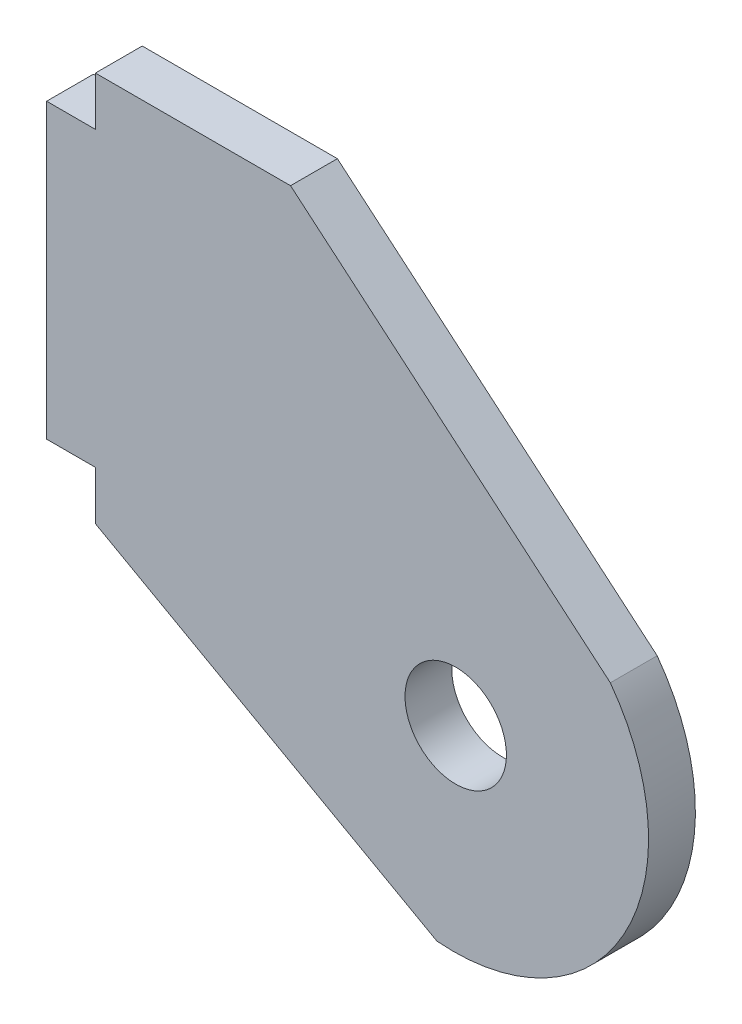
ISO-10303-21;
HEADER;
FILE_DESCRIPTION(('STEP AP214'),'2;1');
FILE_NAME('part.step','',(''),(''),'','','');
FILE_SCHEMA(('AUTOMOTIVE_DESIGN { 1 0 10303 214 1 1 1 1 }'));
ENDSEC;
DATA;
#1=APPLICATION_CONTEXT('core data for automotive mechanical design processes');
#2=APPLICATION_PROTOCOL_DEFINITION('international standard','automotive_design',2000,#1);
#3=PRODUCT_CONTEXT('',#1,'mechanical');
#4=PRODUCT('Part','Part','',(#3));
#5=PRODUCT_RELATED_PRODUCT_CATEGORY('part','',(#4));
#6=PRODUCT_DEFINITION_FORMATION('','',#4);
#7=PRODUCT_DEFINITION_CONTEXT('part definition',#1,'design');
#8=PRODUCT_DEFINITION('design','',#6,#7);
#9=PRODUCT_DEFINITION_SHAPE('','',#8);
#10=(LENGTH_UNIT() NAMED_UNIT(*) SI_UNIT(.MILLI.,.METRE.));
#11=(NAMED_UNIT(*) PLANE_ANGLE_UNIT() SI_UNIT($,.RADIAN.));
#12=(NAMED_UNIT(*) SI_UNIT($,.STERADIAN.) SOLID_ANGLE_UNIT());
#13=UNCERTAINTY_MEASURE_WITH_UNIT(LENGTH_MEASURE(1.E-05),#10,'distance_accuracy_value','');
#14=(GEOMETRIC_REPRESENTATION_CONTEXT(3) GLOBAL_UNCERTAINTY_ASSIGNED_CONTEXT((#13)) GLOBAL_UNIT_ASSIGNED_CONTEXT((#10,
#11,#12)) REPRESENTATION_CONTEXT('',''));
#15=CARTESIAN_POINT('',(0.,0.,0.));
#16=DIRECTION('',(0.,0.,1.));
#17=DIRECTION('',(1.,0.,0.));
#18=AXIS2_PLACEMENT_3D('',#15,#16,#17);
#19=CARTESIAN_POINT('',(451.22163735712,-25.1612518869902,3.048));
#20=DIRECTION('',(0.,0.,1.));
#21=DIRECTION('',(1.,0.,0.));
#22=AXIS2_PLACEMENT_3D('',#19,#20,#21);
#23=PLANE('',#22);
#24=DIRECTION('',(0.,-1.,0.));
#25=VECTOR('',#24,1.);
#26=CARTESIAN_POINT('',(427.91942335712,0.,3.048));
#27=LINE('',#26,#25);
#28=CARTESIAN_POINT('',(427.91942335712,0.,3.048));
#29=VERTEX_POINT('',#28);
#30=CARTESIAN_POINT('',(427.91942335712,-3.17499999999997,3.048));
#31=VERTEX_POINT('',#30);
#32=EDGE_CURVE('E159',#29,#31,#27,.T.);
#33=ORIENTED_EDGE('',*,*,#32,.T.);
#34=DIRECTION('',(-1.,0.,0.));
#35=VECTOR('',#34,1.);
#36=CARTESIAN_POINT('',(424.74442335712,-3.17499999999998,3.048));
#37=LINE('',#36,#35);
#38=CARTESIAN_POINT('',(424.74442335712,-3.17499999999998,3.048));
#39=VERTEX_POINT('',#38);
#40=EDGE_CURVE('E102',#31,#39,#37,.T.);
#41=ORIENTED_EDGE('',*,*,#40,.T.);
#42=DIRECTION('',(0.,-1.,0.));
#43=VECTOR('',#42,1.);
#44=CARTESIAN_POINT('',(424.74442335712,-22.225,3.048));
#45=LINE('',#44,#43);
#46=CARTESIAN_POINT('',(424.74442335712,-22.225,3.048));
#47=VERTEX_POINT('',#46);
#48=EDGE_CURVE('E177',#39,#47,#45,.T.);
#49=ORIENTED_EDGE('',*,*,#48,.T.);
#50=DIRECTION('',(1.,0.,0.));
#51=VECTOR('',#50,1.);
#52=CARTESIAN_POINT('',(427.91942335712,-22.225,3.048));
#53=LINE('',#52,#51);
#54=CARTESIAN_POINT('',(427.91942335712,-22.225,3.048));
#55=VERTEX_POINT('',#54);
#56=EDGE_CURVE('E194',#47,#55,#53,.T.);
#57=ORIENTED_EDGE('',*,*,#56,.T.);
#58=DIRECTION('',(0.,-1.,0.));
#59=VECTOR('',#58,1.);
#60=CARTESIAN_POINT('',(427.91942335712,-22.225,3.048));
#61=LINE('',#60,#59);
#62=CARTESIAN_POINT('',(427.91942335712,-25.3999999999999,3.048));
#63=VERTEX_POINT('',#62);
#64=EDGE_CURVE('E193',#55,#63,#61,.T.);
#65=ORIENTED_EDGE('',*,*,#64,.T.);
#66=DIRECTION('',(0.873016540263343,-0.487690599075503,0.));
#67=VECTOR('',#66,1.);
#68=CARTESIAN_POINT('',(427.91942335712,-25.3999999999999,3.048));
#69=LINE('',#68,#67);
#70=CARTESIAN_POINT('',(450.14442335712,-37.8154847755616,3.048));
#71=VERTEX_POINT('',#70);
#72=EDGE_CURVE('E124',#63,#71,#69,.T.);
#73=ORIENTED_EDGE('',*,*,#72,.T.);
#74=CARTESIAN_POINT('',(451.22163735712,-25.1612518869902,3.048));
#75=DIRECTION('',(0.,0.,1.));
#76=DIRECTION('',(1.,0.,0.));
#77=AXIS2_PLACEMENT_3D('',#74,#75,#76);
#78=CIRCLE('',#77,12.7);
#79=CARTESIAN_POINT('',(461.432219062766,-17.6091646766659,3.048));
#80=VERTEX_POINT('',#79);
#81=EDGE_CURVE('E118',#71,#80,#78,.T.);
#82=ORIENTED_EDGE('',*,*,#81,.T.);
#83=DIRECTION('',(-0.763416353611531,0.645906704593221,0.));
#84=VECTOR('',#83,1.);
#85=CARTESIAN_POINT('',(440.61942335712,0.,3.048));
#86=LINE('',#85,#84);
#87=CARTESIAN_POINT('',(440.61942335712,0.,3.048));
#88=VERTEX_POINT('',#87);
#89=EDGE_CURVE('E122',#80,#88,#86,.T.);
#90=ORIENTED_EDGE('',*,*,#89,.T.);
#91=DIRECTION('',(-1.,0.,0.));
#92=VECTOR('',#91,1.);
#93=CARTESIAN_POINT('',(427.91942335712,0.,3.048));
#94=LINE('',#93,#92);
#95=EDGE_CURVE('E56',#88,#29,#94,.T.);
#96=ORIENTED_EDGE('',*,*,#95,.T.);
#97=EDGE_LOOP('',(#33,#41,#49,#57,#65,#73,#82,#90,#96));
#98=FACE_BOUND('',#97,.T.);
#99=CARTESIAN_POINT('',(451.36820500912,-25.0582413885403,3.048));
#100=DIRECTION('',(0.,0.,1.));
#101=DIRECTION('',(1.,0.,0.));
#102=AXIS2_PLACEMENT_3D('',#99,#100,#101);
#103=CIRCLE('',#102,3.30000000000003);
#104=CARTESIAN_POINT('',(448.06820500912,-25.0582413885403,3.048));
#105=VERTEX_POINT('',#104);
#106=EDGE_CURVE('E146',#105,#105,#103,.T.);
#107=ORIENTED_EDGE('',*,*,#106,.F.);
#108=EDGE_LOOP('',(#107));
#109=FACE_BOUND('',#108,.T.);
#110=ADVANCED_FACE('F39',(#98,#109),#23,.T.);
#111=CARTESIAN_POINT('',(451.22163735712,-25.1612518869902,0.));
#112=DIRECTION('',(0.,0.,1.));
#113=DIRECTION('',(1.,0.,0.));
#114=AXIS2_PLACEMENT_3D('',#111,#112,#113);
#115=PLANE('',#114);
#116=DIRECTION('',(0.,-1.,0.));
#117=VECTOR('',#116,1.);
#118=CARTESIAN_POINT('',(427.91942335712,0.,0.));
#119=LINE('',#118,#117);
#120=CARTESIAN_POINT('',(427.91942335712,0.,0.));
#121=VERTEX_POINT('',#120);
#122=CARTESIAN_POINT('',(427.91942335712,-3.17499999999997,0.));
#123=VERTEX_POINT('',#122);
#124=EDGE_CURVE('E142',#121,#123,#119,.T.);
#125=ORIENTED_EDGE('',*,*,#124,.F.);
#126=DIRECTION('',(-1.,0.,0.));
#127=VECTOR('',#126,1.);
#128=CARTESIAN_POINT('',(427.91942335712,0.,0.));
#129=LINE('',#128,#127);
#130=CARTESIAN_POINT('',(440.61942335712,0.,0.));
#131=VERTEX_POINT('',#130);
#132=EDGE_CURVE('E94',#131,#121,#129,.T.);
#133=ORIENTED_EDGE('',*,*,#132,.F.);
#134=DIRECTION('',(-0.763416353611531,0.645906704593221,0.));
#135=VECTOR('',#134,1.);
#136=CARTESIAN_POINT('',(440.61942335712,0.,0.));
#137=LINE('',#136,#135);
#138=CARTESIAN_POINT('',(461.432219062766,-17.6091646766659,0.));
#139=VERTEX_POINT('',#138);
#140=EDGE_CURVE('E88',#139,#131,#137,.T.);
#141=ORIENTED_EDGE('',*,*,#140,.F.);
#142=CARTESIAN_POINT('',(451.22163735712,-25.1612518869902,0.));
#143=DIRECTION('',(0.,0.,1.));
#144=DIRECTION('',(1.,0.,0.));
#145=AXIS2_PLACEMENT_3D('',#142,#143,#144);
#146=CIRCLE('',#145,12.7);
#147=CARTESIAN_POINT('',(450.14442335712,-37.8154847755616,0.));
#148=VERTEX_POINT('',#147);
#149=EDGE_CURVE('E132',#148,#139,#146,.T.);
#150=ORIENTED_EDGE('',*,*,#149,.F.);
#151=DIRECTION('',(0.873016540263343,-0.487690599075503,0.));
#152=VECTOR('',#151,1.);
#153=CARTESIAN_POINT('',(427.91942335712,-25.3999999999999,0.));
#154=LINE('',#153,#152);
#155=CARTESIAN_POINT('',(427.91942335712,-25.3999999999999,0.));
#156=VERTEX_POINT('',#155);
#157=EDGE_CURVE('E154',#156,#148,#154,.T.);
#158=ORIENTED_EDGE('',*,*,#157,.F.);
#159=DIRECTION('',(0.,-1.,0.));
#160=VECTOR('',#159,1.);
#161=CARTESIAN_POINT('',(427.91942335712,-22.225,0.));
#162=LINE('',#161,#160);
#163=CARTESIAN_POINT('',(427.91942335712,-22.225,0.));
#164=VERTEX_POINT('',#163);
#165=EDGE_CURVE('E152',#164,#156,#162,.T.);
#166=ORIENTED_EDGE('',*,*,#165,.F.);
#167=DIRECTION('',(1.,0.,0.));
#168=VECTOR('',#167,1.);
#169=CARTESIAN_POINT('',(427.91942335712,-22.225,0.));
#170=LINE('',#169,#168);
#171=CARTESIAN_POINT('',(424.74442335712,-22.225,0.));
#172=VERTEX_POINT('',#171);
#173=EDGE_CURVE('E150',#172,#164,#170,.T.);
#174=ORIENTED_EDGE('',*,*,#173,.F.);
#175=DIRECTION('',(0.,-1.,0.));
#176=VECTOR('',#175,1.);
#177=CARTESIAN_POINT('',(424.74442335712,-22.225,0.));
#178=LINE('',#177,#176);
#179=CARTESIAN_POINT('',(424.74442335712,-3.17499999999998,0.));
#180=VERTEX_POINT('',#179);
#181=EDGE_CURVE('E148',#180,#172,#178,.T.);
#182=ORIENTED_EDGE('',*,*,#181,.F.);
#183=DIRECTION('',(-1.,0.,0.));
#184=VECTOR('',#183,1.);
#185=CARTESIAN_POINT('',(424.74442335712,-3.17499999999998,0.));
#186=LINE('',#185,#184);
#187=EDGE_CURVE('E145',#123,#180,#186,.T.);
#188=ORIENTED_EDGE('',*,*,#187,.F.);
#189=EDGE_LOOP('',(#125,#133,#141,#150,#158,#166,#174,#182,#188));
#190=FACE_BOUND('',#189,.T.);
#191=CARTESIAN_POINT('',(451.36820500912,-25.0582413885403,0.));
#192=DIRECTION('',(0.,0.,1.));
#193=DIRECTION('',(1.,0.,0.));
#194=AXIS2_PLACEMENT_3D('',#191,#192,#193);
#195=CIRCLE('',#194,3.30000000000003);
#196=CARTESIAN_POINT('',(448.06820500912,-25.0582413885403,0.));
#197=VERTEX_POINT('',#196);
#198=EDGE_CURVE('E201',#197,#197,#195,.T.);
#199=ORIENTED_EDGE('',*,*,#198,.T.);
#200=EDGE_LOOP('',(#199));
#201=FACE_BOUND('',#200,.T.);
#202=ADVANCED_FACE('F181',(#190,#201),#115,.F.);
#203=CARTESIAN_POINT('',(427.91942335712,0.,3.048));
#204=DIRECTION('',(1.,0.,0.));
#205=DIRECTION('',(0.,0.,-1.));
#206=AXIS2_PLACEMENT_3D('',#203,#204,#205);
#207=PLANE('',#206);
#208=ORIENTED_EDGE('',*,*,#124,.T.);
#209=DIRECTION('',(0.,0.,-1.));
#210=VECTOR('',#209,1.);
#211=CARTESIAN_POINT('',(427.91942335712,-3.17499999999997,3.048));
#212=LINE('',#211,#210);
#213=EDGE_CURVE('E11',#31,#123,#212,.T.);
#214=ORIENTED_EDGE('',*,*,#213,.F.);
#215=ORIENTED_EDGE('',*,*,#32,.F.);
#216=DIRECTION('',(0.,0.,-1.));
#217=VECTOR('',#216,1.);
#218=CARTESIAN_POINT('',(427.91942335712,0.,3.048));
#219=LINE('',#218,#217);
#220=EDGE_CURVE('E138',#29,#121,#219,.T.);
#221=ORIENTED_EDGE('',*,*,#220,.T.);
#222=EDGE_LOOP('',(#208,#214,#215,#221));
#223=FACE_BOUND('',#222,.T.);
#224=ADVANCED_FACE('F41',(#223),#207,.F.);
#225=CARTESIAN_POINT('',(424.74442335712,-3.17499999999998,3.048));
#226=DIRECTION('',(0.,-1.,0.));
#227=DIRECTION('',(1.,0.,0.));
#228=AXIS2_PLACEMENT_3D('',#225,#226,#227);
#229=PLANE('',#228);
#230=ORIENTED_EDGE('',*,*,#187,.T.);
#231=DIRECTION('',(0.,0.,-1.));
#232=VECTOR('',#231,1.);
#233=CARTESIAN_POINT('',(424.74442335712,-3.17499999999998,3.048));
#234=LINE('',#233,#232);
#235=EDGE_CURVE('E48',#39,#180,#234,.T.);
#236=ORIENTED_EDGE('',*,*,#235,.F.);
#237=ORIENTED_EDGE('',*,*,#40,.F.);
#238=ORIENTED_EDGE('',*,*,#213,.T.);
#239=EDGE_LOOP('',(#230,#236,#237,#238));
#240=FACE_BOUND('',#239,.T.);
#241=ADVANCED_FACE('F233',(#240),#229,.F.);
#242=CARTESIAN_POINT('',(424.74442335712,-22.225,3.048));
#243=DIRECTION('',(1.,0.,0.));
#244=DIRECTION('',(0.,0.,-1.));
#245=AXIS2_PLACEMENT_3D('',#242,#243,#244);
#246=PLANE('',#245);
#247=ORIENTED_EDGE('',*,*,#181,.T.);
#248=DIRECTION('',(0.,0.,-1.));
#249=VECTOR('',#248,1.);
#250=CARTESIAN_POINT('',(424.74442335712,-22.225,3.048));
#251=LINE('',#250,#249);
#252=EDGE_CURVE('E169',#47,#172,#251,.T.);
#253=ORIENTED_EDGE('',*,*,#252,.F.);
#254=ORIENTED_EDGE('',*,*,#48,.F.);
#255=ORIENTED_EDGE('',*,*,#235,.T.);
#256=EDGE_LOOP('',(#247,#253,#254,#255));
#257=FACE_BOUND('',#256,.T.);
#258=ADVANCED_FACE('F175',(#257),#246,.F.);
#259=CARTESIAN_POINT('',(427.91942335712,-22.225,3.048));
#260=DIRECTION('',(0.,1.,0.));
#261=DIRECTION('',(-1.,0.,0.));
#262=AXIS2_PLACEMENT_3D('',#259,#260,#261);
#263=PLANE('',#262);
#264=ORIENTED_EDGE('',*,*,#173,.T.);
#265=DIRECTION('',(0.,0.,-1.));
#266=VECTOR('',#265,1.);
#267=CARTESIAN_POINT('',(427.91942335712,-22.225,3.048));
#268=LINE('',#267,#266);
#269=EDGE_CURVE('E166',#55,#164,#268,.T.);
#270=ORIENTED_EDGE('',*,*,#269,.F.);
#271=ORIENTED_EDGE('',*,*,#56,.F.);
#272=ORIENTED_EDGE('',*,*,#252,.T.);
#273=EDGE_LOOP('',(#264,#270,#271,#272));
#274=FACE_BOUND('',#273,.T.);
#275=ADVANCED_FACE('F187',(#274),#263,.F.);
#276=CARTESIAN_POINT('',(427.91942335712,-22.225,3.048));
#277=DIRECTION('',(1.,0.,0.));
#278=DIRECTION('',(0.,0.,-1.));
#279=AXIS2_PLACEMENT_3D('',#276,#277,#278);
#280=PLANE('',#279);
#281=ORIENTED_EDGE('',*,*,#165,.T.);
#282=DIRECTION('',(0.,0.,-1.));
#283=VECTOR('',#282,1.);
#284=CARTESIAN_POINT('',(427.91942335712,-25.3999999999999,3.048));
#285=LINE('',#284,#283);
#286=EDGE_CURVE('E163',#63,#156,#285,.T.);
#287=ORIENTED_EDGE('',*,*,#286,.F.);
#288=ORIENTED_EDGE('',*,*,#64,.F.);
#289=ORIENTED_EDGE('',*,*,#269,.T.);
#290=EDGE_LOOP('',(#281,#287,#288,#289));
#291=FACE_BOUND('',#290,.T.);
#292=ADVANCED_FACE('F191',(#291),#280,.F.);
#293=CARTESIAN_POINT('',(427.91942335712,-25.3999999999999,3.048));
#294=DIRECTION('',(0.487690599075503,0.873016540263343,0.));
#295=DIRECTION('',(-0.873016540263343,0.487690599075503,0.));
#296=AXIS2_PLACEMENT_3D('',#293,#294,#295);
#297=PLANE('',#296);
#298=ORIENTED_EDGE('',*,*,#157,.T.);
#299=DIRECTION('',(0.,0.,-1.));
#300=VECTOR('',#299,1.);
#301=CARTESIAN_POINT('',(450.14442335712,-37.8154847755616,3.048));
#302=LINE('',#301,#300);
#303=EDGE_CURVE('E133',#71,#148,#302,.T.);
#304=ORIENTED_EDGE('',*,*,#303,.F.);
#305=ORIENTED_EDGE('',*,*,#72,.F.);
#306=ORIENTED_EDGE('',*,*,#286,.T.);
#307=EDGE_LOOP('',(#298,#304,#305,#306));
#308=FACE_BOUND('',#307,.T.);
#309=ADVANCED_FACE('F224',(#308),#297,.F.);
#310=CARTESIAN_POINT('',(451.22163735712,-25.1612518869902,3.048));
#311=DIRECTION('',(0.,0.,-1.));
#312=DIRECTION('',(-1.,0.,0.));
#313=AXIS2_PLACEMENT_3D('',#310,#311,#312);
#314=CYLINDRICAL_SURFACE('',#313,12.7);
#315=ORIENTED_EDGE('',*,*,#149,.T.);
#316=DIRECTION('',(0.,0.,-1.));
#317=VECTOR('',#316,1.);
#318=CARTESIAN_POINT('',(461.432219062766,-17.6091646766659,3.048));
#319=LINE('',#318,#317);
#320=EDGE_CURVE('E129',#80,#139,#319,.T.);
#321=ORIENTED_EDGE('',*,*,#320,.F.);
#322=ORIENTED_EDGE('',*,*,#81,.F.);
#323=ORIENTED_EDGE('',*,*,#303,.T.);
#324=EDGE_LOOP('',(#315,#321,#322,#323));
#325=FACE_BOUND('',#324,.T.);
#326=ADVANCED_FACE('F130',(#325),#314,.T.);
#327=CARTESIAN_POINT('',(440.61942335712,0.,3.048));
#328=DIRECTION('',(-0.645906704593221,-0.763416353611531,0.));
#329=DIRECTION('',(0.763416353611531,-0.645906704593221,0.));
#330=AXIS2_PLACEMENT_3D('',#327,#328,#329);
#331=PLANE('',#330);
#332=ORIENTED_EDGE('',*,*,#140,.T.);
#333=DIRECTION('',(0.,0.,-1.));
#334=VECTOR('',#333,1.);
#335=CARTESIAN_POINT('',(440.61942335712,0.,3.048));
#336=LINE('',#335,#334);
#337=EDGE_CURVE('E134',#88,#131,#336,.T.);
#338=ORIENTED_EDGE('',*,*,#337,.F.);
#339=ORIENTED_EDGE('',*,*,#89,.F.);
#340=ORIENTED_EDGE('',*,*,#320,.T.);
#341=EDGE_LOOP('',(#332,#338,#339,#340));
#342=FACE_BOUND('',#341,.T.);
#343=ADVANCED_FACE('F136',(#342),#331,.F.);
#344=CARTESIAN_POINT('',(427.91942335712,0.,3.048));
#345=DIRECTION('',(0.,-1.,0.));
#346=DIRECTION('',(0.,0.,-1.));
#347=AXIS2_PLACEMENT_3D('',#344,#345,#346);
#348=PLANE('',#347);
#349=ORIENTED_EDGE('',*,*,#132,.T.);
#350=ORIENTED_EDGE('',*,*,#220,.F.);
#351=ORIENTED_EDGE('',*,*,#95,.F.);
#352=ORIENTED_EDGE('',*,*,#337,.T.);
#353=EDGE_LOOP('',(#349,#350,#351,#352));
#354=FACE_BOUND('',#353,.T.);
#355=ADVANCED_FACE('F217',(#354),#348,.F.);
#356=CARTESIAN_POINT('',(451.36820500912,-25.0582413885403,3.048));
#357=DIRECTION('',(0.,0.,-1.));
#358=DIRECTION('',(-1.,0.,0.));
#359=AXIS2_PLACEMENT_3D('',#356,#357,#358);
#360=CYLINDRICAL_SURFACE('',#359,3.30000000000003);
#361=CARTESIAN_POINT('',(448.06820500912,-25.0582413885403,3.048));
#362=CARTESIAN_POINT('',(448.06820500912,-25.0582413885403,3.01625));
#363=CARTESIAN_POINT('',(448.06820500912,-25.0582413885403,2.9845));
#364=CARTESIAN_POINT('',(448.06820500912,-25.0582413885403,2.921));
#365=CARTESIAN_POINT('',(448.06820500912,-25.0582413885403,2.88925));
#366=CARTESIAN_POINT('',(448.06820500912,-25.0582413885403,2.82575));
#367=CARTESIAN_POINT('',(448.06820500912,-25.0582413885403,2.794));
#368=CARTESIAN_POINT('',(448.06820500912,-25.0582413885403,2.7305));
#369=CARTESIAN_POINT('',(448.06820500912,-25.0582413885403,2.69875));
#370=CARTESIAN_POINT('',(448.06820500912,-25.0582413885403,2.63525));
#371=CARTESIAN_POINT('',(448.06820500912,-25.0582413885403,2.6035));
#372=CARTESIAN_POINT('',(448.06820500912,-25.0582413885403,2.54));
#373=CARTESIAN_POINT('',(448.06820500912,-25.0582413885403,2.50825));
#374=CARTESIAN_POINT('',(448.06820500912,-25.0582413885403,2.44475));
#375=CARTESIAN_POINT('',(448.06820500912,-25.0582413885403,2.413));
#376=CARTESIAN_POINT('',(448.06820500912,-25.0582413885403,2.3495));
#377=CARTESIAN_POINT('',(448.06820500912,-25.0582413885403,2.31775));
#378=CARTESIAN_POINT('',(448.06820500912,-25.0582413885403,2.25425));
#379=CARTESIAN_POINT('',(448.06820500912,-25.0582413885403,2.2225));
#380=CARTESIAN_POINT('',(448.06820500912,-25.0582413885403,2.159));
#381=CARTESIAN_POINT('',(448.06820500912,-25.0582413885403,2.12725));
#382=CARTESIAN_POINT('',(448.06820500912,-25.0582413885403,2.06375));
#383=CARTESIAN_POINT('',(448.06820500912,-25.0582413885403,2.032));
#384=CARTESIAN_POINT('',(448.06820500912,-25.0582413885403,1.9685));
#385=CARTESIAN_POINT('',(448.06820500912,-25.0582413885403,1.93675));
#386=CARTESIAN_POINT('',(448.06820500912,-25.0582413885403,1.87325));
#387=CARTESIAN_POINT('',(448.06820500912,-25.0582413885403,1.8415));
#388=CARTESIAN_POINT('',(448.06820500912,-25.0582413885403,1.778));
#389=CARTESIAN_POINT('',(448.06820500912,-25.0582413885403,1.74625));
#390=CARTESIAN_POINT('',(448.06820500912,-25.0582413885403,1.68275));
#391=CARTESIAN_POINT('',(448.06820500912,-25.0582413885403,1.651));
#392=CARTESIAN_POINT('',(448.06820500912,-25.0582413885403,1.5875));
#393=CARTESIAN_POINT('',(448.06820500912,-25.0582413885403,1.55575));
#394=CARTESIAN_POINT('',(448.06820500912,-25.0582413885403,1.49225));
#395=CARTESIAN_POINT('',(448.06820500912,-25.0582413885403,1.4605));
#396=CARTESIAN_POINT('',(448.06820500912,-25.0582413885403,1.397));
#397=CARTESIAN_POINT('',(448.06820500912,-25.0582413885403,1.36525));
#398=CARTESIAN_POINT('',(448.06820500912,-25.0582413885403,1.30175));
#399=CARTESIAN_POINT('',(448.06820500912,-25.0582413885403,1.27));
#400=CARTESIAN_POINT('',(448.06820500912,-25.0582413885403,1.2065));
#401=CARTESIAN_POINT('',(448.06820500912,-25.0582413885403,1.17475));
#402=CARTESIAN_POINT('',(448.06820500912,-25.0582413885403,1.11125));
#403=CARTESIAN_POINT('',(448.06820500912,-25.0582413885403,1.0795));
#404=CARTESIAN_POINT('',(448.06820500912,-25.0582413885403,1.016));
#405=CARTESIAN_POINT('',(448.06820500912,-25.0582413885403,0.98425));
#406=CARTESIAN_POINT('',(448.06820500912,-25.0582413885403,0.92075));
#407=CARTESIAN_POINT('',(448.06820500912,-25.0582413885403,0.889));
#408=CARTESIAN_POINT('',(448.06820500912,-25.0582413885403,0.8255));
#409=CARTESIAN_POINT('',(448.06820500912,-25.0582413885403,0.79375));
#410=CARTESIAN_POINT('',(448.06820500912,-25.0582413885403,0.73025));
#411=CARTESIAN_POINT('',(448.06820500912,-25.0582413885403,0.6985));
#412=CARTESIAN_POINT('',(448.06820500912,-25.0582413885403,0.635));
#413=CARTESIAN_POINT('',(448.06820500912,-25.0582413885403,0.60325));
#414=CARTESIAN_POINT('',(448.06820500912,-25.0582413885403,0.53975));
#415=CARTESIAN_POINT('',(448.06820500912,-25.0582413885403,0.508));
#416=CARTESIAN_POINT('',(448.06820500912,-25.0582413885403,0.4445));
#417=CARTESIAN_POINT('',(448.06820500912,-25.0582413885403,0.41275));
#418=CARTESIAN_POINT('',(448.06820500912,-25.0582413885403,0.34925));
#419=CARTESIAN_POINT('',(448.06820500912,-25.0582413885403,0.3175));
#420=CARTESIAN_POINT('',(448.06820500912,-25.0582413885403,0.254));
#421=CARTESIAN_POINT('',(448.06820500912,-25.0582413885403,0.22225));
#422=CARTESIAN_POINT('',(448.06820500912,-25.0582413885403,0.15875));
#423=CARTESIAN_POINT('',(448.06820500912,-25.0582413885403,0.127));
#424=CARTESIAN_POINT('',(448.06820500912,-25.0582413885403,0.0634999999999999));
#425=CARTESIAN_POINT('',(448.06820500912,-25.0582413885403,0.03175));
#426=CARTESIAN_POINT('',(448.06820500912,-25.0582413885403,0.));
#427=B_SPLINE_CURVE_WITH_KNOTS('',3,(#361,#362,#363,#364,#365,#366,#367,#368,#369,#370,#371,
#372,#373,#374,#375,#376,#377,#378,#379,#380,#381,#382,#383,#384,#385,#386,#387,#388,#389,#390,
#391,#392,#393,#394,#395,#396,#397,#398,#399,#400,#401,#402,#403,#404,#405,#406,#407,#408,#409,
#410,#411,#412,#413,#414,#415,#416,#417,#418,#419,#420,#421,#422,#423,#424,#425,#426),
.UNSPECIFIED.,.F.,.F.,(4,2,2,2,2,2,2,2,2,2,2,2,2,2,2,2,2,2,2,2,2,2,2,2,2,2,2,2,2,2,2,2,4),(0.,
0.0952500000000003,0.1905,0.28575,0.381,0.47625,0.5715,0.66675,0.762,0.85725,0.9525,1.04775,
1.143,1.23825,1.3335,1.42875,1.524,1.61925,1.7145,1.80975,1.905,2.00025,2.0955,2.19075,2.286,
2.38125,2.4765,2.57175,2.667,2.76225,2.8575,2.95275,3.048),.UNSPECIFIED.);
#428=EDGE_CURVE('BSEAM207',#105,#197,#427,.T.);
#429=ORIENTED_EDGE('',*,*,#106,.T.);
#430=ORIENTED_EDGE('',*,*,#198,.F.);
#431=ORIENTED_EDGE('',*,*,#428,.T.);
#432=ORIENTED_EDGE('',*,*,#428,.F.);
#433=EDGE_LOOP('',(#429,#431,#430,#432));
#434=FACE_BOUND('',#433,.T.);
#435=ADVANCED_FACE('F207',(#434),#360,.F.);
#436=CLOSED_SHELL('',(#110,#202,#224,#241,#258,#275,#292,#309,#326,#343,#355,#435));
#437=MANIFOLD_SOLID_BREP('B2',#436);
#438=ADVANCED_BREP_SHAPE_REPRESENTATION('',(#18,#437),#14);
#439=SHAPE_DEFINITION_REPRESENTATION(#9,#438);
ENDSEC;
END-ISO-10303-21;
